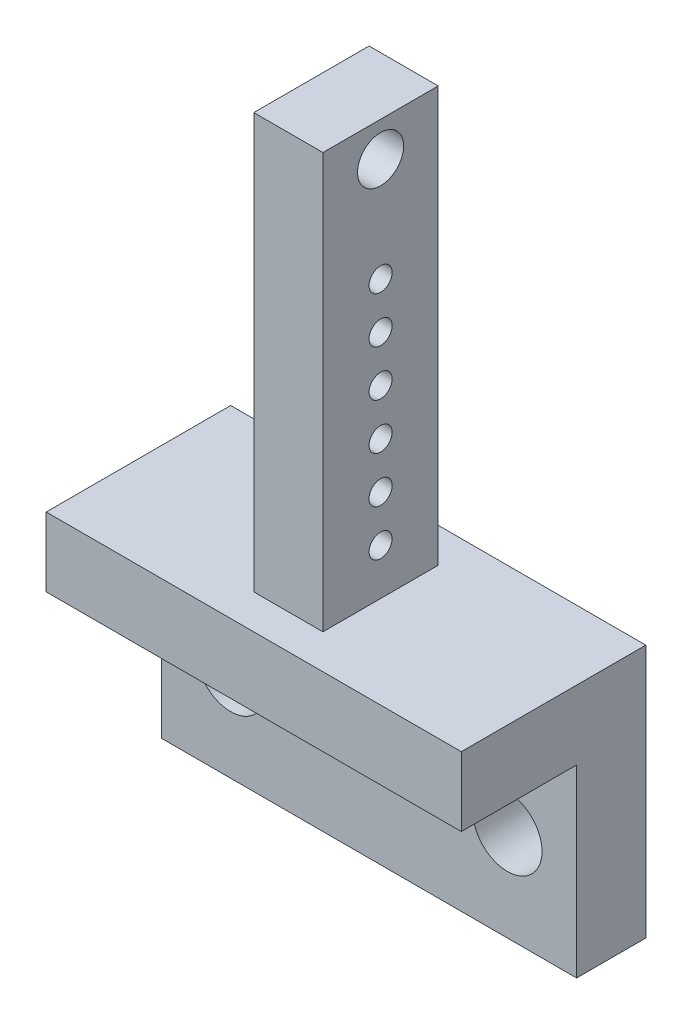
ISO-10303-21;
HEADER;
FILE_DESCRIPTION(('STEP AP214'),'2;1');
FILE_NAME('part.step','',(''),(''),'','','');
FILE_SCHEMA(('AUTOMOTIVE_DESIGN { 1 0 10303 214 1 1 1 1 }'));
ENDSEC;
DATA;
#1=APPLICATION_CONTEXT('core data for automotive mechanical design processes');
#2=APPLICATION_PROTOCOL_DEFINITION('international standard','automotive_design',2000,#1);
#3=PRODUCT_CONTEXT('',#1,'mechanical');
#4=PRODUCT('Part','Part','',(#3));
#5=PRODUCT_RELATED_PRODUCT_CATEGORY('part','',(#4));
#6=PRODUCT_DEFINITION_FORMATION('','',#4);
#7=PRODUCT_DEFINITION_CONTEXT('part definition',#1,'design');
#8=PRODUCT_DEFINITION('design','',#6,#7);
#9=PRODUCT_DEFINITION_SHAPE('','',#8);
#10=(LENGTH_UNIT() NAMED_UNIT(*) SI_UNIT(.MILLI.,.METRE.));
#11=(NAMED_UNIT(*) PLANE_ANGLE_UNIT() SI_UNIT($,.RADIAN.));
#12=(NAMED_UNIT(*) SI_UNIT($,.STERADIAN.) SOLID_ANGLE_UNIT());
#13=UNCERTAINTY_MEASURE_WITH_UNIT(LENGTH_MEASURE(1.E-05),#10,'distance_accuracy_value','');
#14=(GEOMETRIC_REPRESENTATION_CONTEXT(3) GLOBAL_UNCERTAINTY_ASSIGNED_CONTEXT((#13)) GLOBAL_UNIT_ASSIGNED_CONTEXT((#10,
#11,#12)) REPRESENTATION_CONTEXT('',''));
#15=CARTESIAN_POINT('',(0.,0.,0.));
#16=DIRECTION('',(0.,0.,1.));
#17=DIRECTION('',(1.,0.,0.));
#18=AXIS2_PLACEMENT_3D('',#15,#16,#17);
#19=CARTESIAN_POINT('',(-17.2327188940092,4.67626728110599,3.));
#20=DIRECTION('',(0.,-1.,0.));
#21=DIRECTION('',(0.,0.,-1.));
#22=AXIS2_PLACEMENT_3D('',#19,#20,#21);
#23=PLANE('',#22);
#24=DIRECTION('',(-1.,0.,0.));
#25=VECTOR('',#24,1.);
#26=CARTESIAN_POINT('',(-17.2327188940092,4.67626728110599,0.));
#27=LINE('',#26,#25);
#28=CARTESIAN_POINT('',(0.767281105990783,4.67626728110599,0.));
#29=VERTEX_POINT('',#28);
#30=CARTESIAN_POINT('',(-17.2327188940092,4.67626728110599,0.));
#31=VERTEX_POINT('',#30);
#32=EDGE_CURVE('E179',#29,#31,#27,.T.);
#33=ORIENTED_EDGE('',*,*,#32,.T.);
#34=DIRECTION('',(0.,0.,-1.));
#35=VECTOR('',#34,1.);
#36=CARTESIAN_POINT('',(-17.2327188940092,4.67626728110599,3.));
#37=LINE('',#36,#35);
#38=CARTESIAN_POINT('',(-17.2327188940092,4.67626728110599,8.));
#39=VERTEX_POINT('',#38);
#40=EDGE_CURVE('E42',#39,#31,#37,.T.);
#41=ORIENTED_EDGE('',*,*,#40,.F.);
#42=DIRECTION('',(-1.,0.,0.));
#43=VECTOR('',#42,1.);
#44=CARTESIAN_POINT('',(0.767281105990783,4.67626728110599,8.));
#45=LINE('',#44,#43);
#46=CARTESIAN_POINT('',(0.767281105990783,4.67626728110599,8.));
#47=VERTEX_POINT('',#46);
#48=EDGE_CURVE('E143',#47,#39,#45,.T.);
#49=ORIENTED_EDGE('',*,*,#48,.F.);
#50=DIRECTION('',(0.,0.,-1.));
#51=VECTOR('',#50,1.);
#52=CARTESIAN_POINT('',(0.767281105990783,4.67626728110599,3.));
#53=LINE('',#52,#51);
#54=EDGE_CURVE('E11',#47,#29,#53,.T.);
#55=ORIENTED_EDGE('',*,*,#54,.T.);
#56=EDGE_LOOP('',(#33,#41,#49,#55));
#57=FACE_BOUND('',#56,.T.);
#58=DIRECTION('',(0.,0.,-1.));
#59=VECTOR('',#58,1.);
#60=CARTESIAN_POINT('',(-6.73271889400921,4.67626728110599,1.5));
#61=LINE('',#60,#59);
#62=CARTESIAN_POINT('',(-6.73271889400921,4.67626728110599,6.5));
#63=VERTEX_POINT('',#62);
#64=CARTESIAN_POINT('',(-6.73271889400921,4.67626728110599,1.5));
#65=VERTEX_POINT('',#64);
#66=EDGE_CURVE('E50',#63,#65,#61,.T.);
#67=ORIENTED_EDGE('',*,*,#66,.F.);
#68=DIRECTION('',(1.,0.,0.));
#69=VECTOR('',#68,1.);
#70=CARTESIAN_POINT('',(-9.73271889400921,4.67626728110599,6.5));
#71=LINE('',#70,#69);
#72=CARTESIAN_POINT('',(-9.73271889400921,4.67626728110599,6.5));
#73=VERTEX_POINT('',#72);
#74=EDGE_CURVE('E54',#73,#63,#71,.T.);
#75=ORIENTED_EDGE('',*,*,#74,.F.);
#76=DIRECTION('',(0.,0.,1.));
#77=VECTOR('',#76,1.);
#78=CARTESIAN_POINT('',(-9.73271889400921,4.67626728110599,1.5));
#79=LINE('',#78,#77);
#80=CARTESIAN_POINT('',(-9.73271889400921,4.67626728110599,1.5));
#81=VERTEX_POINT('',#80);
#82=EDGE_CURVE('E215',#81,#73,#79,.T.);
#83=ORIENTED_EDGE('',*,*,#82,.F.);
#84=DIRECTION('',(-1.,0.,0.));
#85=VECTOR('',#84,1.);
#86=CARTESIAN_POINT('',(-9.73271889400921,4.67626728110599,1.5));
#87=LINE('',#86,#85);
#88=EDGE_CURVE('E213',#65,#81,#87,.T.);
#89=ORIENTED_EDGE('',*,*,#88,.F.);
#90=EDGE_LOOP('',(#67,#75,#83,#89));
#91=FACE_BOUND('',#90,.T.);
#92=ADVANCED_FACE('F33',(#57,#91),#23,.F.);
#93=CARTESIAN_POINT('',(0.,0.,3.));
#94=DIRECTION('',(0.,0.,1.));
#95=DIRECTION('',(1.,0.,0.));
#96=AXIS2_PLACEMENT_3D('',#93,#94,#95);
#97=PLANE('',#96);
#98=DIRECTION('',(1.,0.,0.));
#99=VECTOR('',#98,1.);
#100=CARTESIAN_POINT('',(0.767281105990783,1.67626728110599,3.));
#101=LINE('',#100,#99);
#102=CARTESIAN_POINT('',(-17.2327188940092,1.67626728110599,3.));
#103=VERTEX_POINT('',#102);
#104=CARTESIAN_POINT('',(0.767281105990783,1.67626728110599,3.));
#105=VERTEX_POINT('',#104);
#106=EDGE_CURVE('E132',#103,#105,#101,.T.);
#107=ORIENTED_EDGE('',*,*,#106,.F.);
#108=DIRECTION('',(0.,-1.,0.));
#109=VECTOR('',#108,1.);
#110=CARTESIAN_POINT('',(-17.2327188940092,4.67626728110599,3.));
#111=LINE('',#110,#109);
#112=CARTESIAN_POINT('',(-17.2327188940092,-6.32373271889401,3.));
#113=VERTEX_POINT('',#112);
#114=EDGE_CURVE('E171',#103,#113,#111,.T.);
#115=ORIENTED_EDGE('',*,*,#114,.T.);
#116=DIRECTION('',(1.,0.,0.));
#117=VECTOR('',#116,1.);
#118=CARTESIAN_POINT('',(-17.2327188940092,-6.32373271889401,3.));
#119=LINE('',#118,#117);
#120=CARTESIAN_POINT('',(0.767281105990786,-6.32373271889401,3.));
#121=VERTEX_POINT('',#120);
#122=EDGE_CURVE('E174',#113,#121,#119,.T.);
#123=ORIENTED_EDGE('',*,*,#122,.T.);
#124=DIRECTION('',(0.,1.,0.));
#125=VECTOR('',#124,1.);
#126=CARTESIAN_POINT('',(0.767281105990783,4.67626728110599,3.));
#127=LINE('',#126,#125);
#128=EDGE_CURVE('E169',#121,#105,#127,.T.);
#129=ORIENTED_EDGE('',*,*,#128,.T.);
#130=EDGE_LOOP('',(#107,#115,#123,#129));
#131=FACE_BOUND('',#130,.T.);
#132=CARTESIAN_POINT('',(-14.2327188940092,-2.32373271889401,3.));
#133=DIRECTION('',(0.,0.,1.));
#134=DIRECTION('',(1.,0.,0.));
#135=AXIS2_PLACEMENT_3D('',#132,#133,#134);
#136=CIRCLE('',#135,1.5);
#137=CARTESIAN_POINT('',(-12.7327188940092,-2.32373271889401,3.));
#138=VERTEX_POINT('',#137);
#139=EDGE_CURVE('E163',#138,#138,#136,.T.);
#140=ORIENTED_EDGE('',*,*,#139,.F.);
#141=EDGE_LOOP('',(#140));
#142=FACE_BOUND('',#141,.T.);
#143=CARTESIAN_POINT('',(-2.23271889400921,-2.32373271889401,3.));
#144=DIRECTION('',(0.,0.,1.));
#145=DIRECTION('',(1.,0.,0.));
#146=AXIS2_PLACEMENT_3D('',#143,#144,#145);
#147=CIRCLE('',#146,1.5);
#148=CARTESIAN_POINT('',(-0.732718894009214,-2.32373271889401,3.));
#149=VERTEX_POINT('',#148);
#150=EDGE_CURVE('E157',#149,#149,#147,.T.);
#151=ORIENTED_EDGE('',*,*,#150,.F.);
#152=EDGE_LOOP('',(#151));
#153=FACE_BOUND('',#152,.T.);
#154=ADVANCED_FACE('F230',(#131,#142,#153),#97,.T.);
#155=CARTESIAN_POINT('',(0.,0.,0.));
#156=DIRECTION('',(0.,0.,1.));
#157=DIRECTION('',(1.,0.,0.));
#158=AXIS2_PLACEMENT_3D('',#155,#156,#157);
#159=PLANE('',#158);
#160=DIRECTION('',(0.,1.,0.));
#161=VECTOR('',#160,1.);
#162=CARTESIAN_POINT('',(0.767281105990783,4.67626728110599,0.));
#163=LINE('',#162,#161);
#164=CARTESIAN_POINT('',(0.767281105990786,-6.32373271889401,0.));
#165=VERTEX_POINT('',#164);
#166=EDGE_CURVE('E166',#165,#29,#163,.T.);
#167=ORIENTED_EDGE('',*,*,#166,.F.);
#168=DIRECTION('',(1.,0.,0.));
#169=VECTOR('',#168,1.);
#170=CARTESIAN_POINT('',(-17.2327188940092,-6.32373271889401,0.));
#171=LINE('',#170,#169);
#172=CARTESIAN_POINT('',(-17.2327188940092,-6.32373271889401,0.));
#173=VERTEX_POINT('',#172);
#174=EDGE_CURVE('E172',#173,#165,#171,.T.);
#175=ORIENTED_EDGE('',*,*,#174,.F.);
#176=DIRECTION('',(0.,-1.,0.));
#177=VECTOR('',#176,1.);
#178=CARTESIAN_POINT('',(-17.2327188940092,4.67626728110599,0.));
#179=LINE('',#178,#177);
#180=EDGE_CURVE('E181',#31,#173,#179,.T.);
#181=ORIENTED_EDGE('',*,*,#180,.F.);
#182=ORIENTED_EDGE('',*,*,#32,.F.);
#183=EDGE_LOOP('',(#167,#175,#181,#182));
#184=FACE_BOUND('',#183,.T.);
#185=CARTESIAN_POINT('',(-14.2327188940092,-2.32373271889401,0.));
#186=DIRECTION('',(0.,0.,1.));
#187=DIRECTION('',(1.,0.,0.));
#188=AXIS2_PLACEMENT_3D('',#185,#186,#187);
#189=CIRCLE('',#188,1.5);
#190=CARTESIAN_POINT('',(-12.7327188940092,-2.32373271889401,0.));
#191=VERTEX_POINT('',#190);
#192=EDGE_CURVE('E160',#191,#191,#189,.T.);
#193=ORIENTED_EDGE('',*,*,#192,.T.);
#194=EDGE_LOOP('',(#193));
#195=FACE_BOUND('',#194,.T.);
#196=CARTESIAN_POINT('',(-2.23271889400921,-2.32373271889401,0.));
#197=DIRECTION('',(0.,0.,1.));
#198=DIRECTION('',(1.,0.,0.));
#199=AXIS2_PLACEMENT_3D('',#196,#197,#198);
#200=CIRCLE('',#199,1.5);
#201=CARTESIAN_POINT('',(-0.732718894009214,-2.32373271889401,0.));
#202=VERTEX_POINT('',#201);
#203=EDGE_CURVE('E156',#202,#202,#200,.T.);
#204=ORIENTED_EDGE('',*,*,#203,.T.);
#205=EDGE_LOOP('',(#204));
#206=FACE_BOUND('',#205,.T.);
#207=ADVANCED_FACE('F235',(#184,#195,#206),#159,.F.);
#208=CARTESIAN_POINT('',(0.767281105990783,4.67626728110599,3.));
#209=DIRECTION('',(-1.,0.,0.));
#210=DIRECTION('',(0.,-1.,0.));
#211=AXIS2_PLACEMENT_3D('',#208,#209,#210);
#212=PLANE('',#211);
#213=ORIENTED_EDGE('',*,*,#166,.T.);
#214=ORIENTED_EDGE('',*,*,#54,.F.);
#215=DIRECTION('',(0.,1.,0.));
#216=VECTOR('',#215,1.);
#217=CARTESIAN_POINT('',(0.767281105990783,4.67626728110599,8.));
#218=LINE('',#217,#216);
#219=CARTESIAN_POINT('',(0.767281105990783,1.67626728110599,8.));
#220=VERTEX_POINT('',#219);
#221=EDGE_CURVE('E135',#220,#47,#218,.T.);
#222=ORIENTED_EDGE('',*,*,#221,.F.);
#223=DIRECTION('',(0.,0.,-1.));
#224=VECTOR('',#223,1.);
#225=CARTESIAN_POINT('',(0.767281105990783,1.67626728110599,8.));
#226=LINE('',#225,#224);
#227=EDGE_CURVE('E149',#220,#105,#226,.T.);
#228=ORIENTED_EDGE('',*,*,#227,.T.);
#229=ORIENTED_EDGE('',*,*,#128,.F.);
#230=DIRECTION('',(0.,0.,-1.));
#231=VECTOR('',#230,1.);
#232=CARTESIAN_POINT('',(0.767281105990786,-6.32373271889401,3.));
#233=LINE('',#232,#231);
#234=EDGE_CURVE('E176',#121,#165,#233,.T.);
#235=ORIENTED_EDGE('',*,*,#234,.T.);
#236=EDGE_LOOP('',(#213,#214,#222,#228,#229,#235));
#237=FACE_BOUND('',#236,.T.);
#238=ADVANCED_FACE('F35',(#237),#212,.F.);
#239=CARTESIAN_POINT('',(-17.2327188940092,4.67626728110599,3.));
#240=DIRECTION('',(1.,0.,0.));
#241=DIRECTION('',(0.,1.,0.));
#242=AXIS2_PLACEMENT_3D('',#239,#240,#241);
#243=PLANE('',#242);
#244=ORIENTED_EDGE('',*,*,#180,.T.);
#245=DIRECTION('',(0.,0.,-1.));
#246=VECTOR('',#245,1.);
#247=CARTESIAN_POINT('',(-17.2327188940092,-6.32373271889401,3.));
#248=LINE('',#247,#246);
#249=EDGE_CURVE('E186',#113,#173,#248,.T.);
#250=ORIENTED_EDGE('',*,*,#249,.F.);
#251=ORIENTED_EDGE('',*,*,#114,.F.);
#252=DIRECTION('',(0.,0.,-1.));
#253=VECTOR('',#252,1.);
#254=CARTESIAN_POINT('',(-17.2327188940092,1.67626728110599,8.));
#255=LINE('',#254,#253);
#256=CARTESIAN_POINT('',(-17.2327188940092,1.67626728110599,8.));
#257=VERTEX_POINT('',#256);
#258=EDGE_CURVE('E153',#257,#103,#255,.T.);
#259=ORIENTED_EDGE('',*,*,#258,.F.);
#260=DIRECTION('',(0.,-1.,0.));
#261=VECTOR('',#260,1.);
#262=CARTESIAN_POINT('',(-17.2327188940092,4.67626728110599,8.));
#263=LINE('',#262,#261);
#264=EDGE_CURVE('E146',#39,#257,#263,.T.);
#265=ORIENTED_EDGE('',*,*,#264,.F.);
#266=ORIENTED_EDGE('',*,*,#40,.T.);
#267=EDGE_LOOP('',(#244,#250,#251,#259,#265,#266));
#268=FACE_BOUND('',#267,.T.);
#269=ADVANCED_FACE('F239',(#268),#243,.F.);
#270=CARTESIAN_POINT('',(-17.2327188940092,-6.32373271889401,3.));
#271=DIRECTION('',(0.,1.,0.));
#272=DIRECTION('',(-1.,0.,0.));
#273=AXIS2_PLACEMENT_3D('',#270,#271,#272);
#274=PLANE('',#273);
#275=ORIENTED_EDGE('',*,*,#174,.T.);
#276=ORIENTED_EDGE('',*,*,#234,.F.);
#277=ORIENTED_EDGE('',*,*,#122,.F.);
#278=ORIENTED_EDGE('',*,*,#249,.T.);
#279=EDGE_LOOP('',(#275,#276,#277,#278));
#280=FACE_BOUND('',#279,.T.);
#281=ADVANCED_FACE('F242',(#280),#274,.F.);
#282=CARTESIAN_POINT('',(-14.2327188940092,-2.32373271889401,3.));
#283=DIRECTION('',(0.,0.,-1.));
#284=DIRECTION('',(-1.,0.,0.));
#285=AXIS2_PLACEMENT_3D('',#282,#283,#284);
#286=CYLINDRICAL_SURFACE('',#285,1.5);
#287=ORIENTED_EDGE('',*,*,#139,.T.);
#288=EDGE_LOOP('',(#287));
#289=FACE_BOUND('',#288,.T.);
#290=ORIENTED_EDGE('',*,*,#192,.F.);
#291=EDGE_LOOP('',(#290));
#292=FACE_BOUND('',#291,.T.);
#293=ADVANCED_FACE('F246',(#289,#292),#286,.F.);
#294=CARTESIAN_POINT('',(-2.23271889400921,-2.32373271889401,3.));
#295=DIRECTION('',(0.,0.,-1.));
#296=DIRECTION('',(-1.,0.,0.));
#297=AXIS2_PLACEMENT_3D('',#294,#295,#296);
#298=CYLINDRICAL_SURFACE('',#297,1.5);
#299=ORIENTED_EDGE('',*,*,#150,.T.);
#300=EDGE_LOOP('',(#299));
#301=FACE_BOUND('',#300,.T.);
#302=ORIENTED_EDGE('',*,*,#203,.F.);
#303=EDGE_LOOP('',(#302));
#304=FACE_BOUND('',#303,.T.);
#305=ADVANCED_FACE('F253',(#301,#304),#298,.F.);
#306=CARTESIAN_POINT('',(0.767281105990783,1.67626728110599,8.));
#307=DIRECTION('',(0.,1.,0.));
#308=DIRECTION('',(-1.,0.,0.));
#309=AXIS2_PLACEMENT_3D('',#306,#307,#308);
#310=PLANE('',#309);
#311=ORIENTED_EDGE('',*,*,#106,.T.);
#312=ORIENTED_EDGE('',*,*,#227,.F.);
#313=DIRECTION('',(1.,0.,0.));
#314=VECTOR('',#313,1.);
#315=CARTESIAN_POINT('',(0.767281105990783,1.67626728110599,8.));
#316=LINE('',#315,#314);
#317=EDGE_CURVE('E148',#257,#220,#316,.T.);
#318=ORIENTED_EDGE('',*,*,#317,.F.);
#319=ORIENTED_EDGE('',*,*,#258,.T.);
#320=EDGE_LOOP('',(#311,#312,#318,#319));
#321=FACE_BOUND('',#320,.T.);
#322=ADVANCED_FACE('F257',(#321),#310,.F.);
#323=CARTESIAN_POINT('',(0.,0.,8.));
#324=DIRECTION('',(0.,0.,-1.));
#325=DIRECTION('',(-1.,0.,0.));
#326=AXIS2_PLACEMENT_3D('',#323,#324,#325);
#327=PLANE('',#326);
#328=ORIENTED_EDGE('',*,*,#221,.T.);
#329=ORIENTED_EDGE('',*,*,#48,.T.);
#330=ORIENTED_EDGE('',*,*,#264,.T.);
#331=ORIENTED_EDGE('',*,*,#317,.T.);
#332=EDGE_LOOP('',(#328,#329,#330,#331));
#333=FACE_BOUND('',#332,.T.);
#334=ADVANCED_FACE('F261',(#333),#327,.F.);
#335=CARTESIAN_POINT('',(-6.73271889400921,22.676267281106,1.5));
#336=DIRECTION('',(-1.,0.,0.));
#337=DIRECTION('',(0.,0.,1.));
#338=AXIS2_PLACEMENT_3D('',#335,#336,#337);
#339=PLANE('',#338);
#340=CARTESIAN_POINT('',(-6.73271889400921,6.67626728110599,4.));
#341=DIRECTION('',(1.,0.,0.));
#342=DIRECTION('',(0.,0.,-1.));
#343=AXIS2_PLACEMENT_3D('',#340,#341,#342);
#344=CIRCLE('',#343,0.5);
#345=CARTESIAN_POINT('',(-6.73271889400921,6.67626728110599,3.5));
#346=VERTEX_POINT('',#345);
#347=EDGE_CURVE('E195',#346,#346,#344,.T.);
#348=ORIENTED_EDGE('',*,*,#347,.F.);
#349=EDGE_LOOP('',(#348));
#350=FACE_BOUND('',#349,.T.);
#351=CARTESIAN_POINT('',(-6.73271889400921,8.67626728110599,4.));
#352=DIRECTION('',(1.,0.,0.));
#353=DIRECTION('',(0.,0.,-1.));
#354=AXIS2_PLACEMENT_3D('',#351,#352,#353);
#355=CIRCLE('',#354,0.5);
#356=CARTESIAN_POINT('',(-6.73271889400921,8.67626728110599,3.5));
#357=VERTEX_POINT('',#356);
#358=EDGE_CURVE('E309',#357,#357,#355,.T.);
#359=ORIENTED_EDGE('',*,*,#358,.F.);
#360=EDGE_LOOP('',(#359));
#361=FACE_BOUND('',#360,.T.);
#362=CARTESIAN_POINT('',(-6.73271889400921,10.676267281106,4.));
#363=DIRECTION('',(1.,0.,0.));
#364=DIRECTION('',(0.,0.,-1.));
#365=AXIS2_PLACEMENT_3D('',#362,#363,#364);
#366=CIRCLE('',#365,0.5);
#367=CARTESIAN_POINT('',(-6.73271889400921,10.676267281106,3.5));
#368=VERTEX_POINT('',#367);
#369=EDGE_CURVE('E312',#368,#368,#366,.T.);
#370=ORIENTED_EDGE('',*,*,#369,.F.);
#371=EDGE_LOOP('',(#370));
#372=FACE_BOUND('',#371,.T.);
#373=CARTESIAN_POINT('',(-6.73271889400921,12.676267281106,4.));
#374=DIRECTION('',(1.,0.,0.));
#375=DIRECTION('',(0.,0.,-1.));
#376=AXIS2_PLACEMENT_3D('',#373,#374,#375);
#377=CIRCLE('',#376,0.5);
#378=CARTESIAN_POINT('',(-6.73271889400921,12.676267281106,3.5));
#379=VERTEX_POINT('',#378);
#380=EDGE_CURVE('E317',#379,#379,#377,.T.);
#381=ORIENTED_EDGE('',*,*,#380,.F.);
#382=EDGE_LOOP('',(#381));
#383=FACE_BOUND('',#382,.T.);
#384=CARTESIAN_POINT('',(-6.73271889400921,14.676267281106,4.));
#385=DIRECTION('',(1.,0.,0.));
#386=DIRECTION('',(0.,0.,-1.));
#387=AXIS2_PLACEMENT_3D('',#384,#385,#386);
#388=CIRCLE('',#387,0.5);
#389=CARTESIAN_POINT('',(-6.73271889400921,14.676267281106,3.5));
#390=VERTEX_POINT('',#389);
#391=EDGE_CURVE('E320',#390,#390,#388,.T.);
#392=ORIENTED_EDGE('',*,*,#391,.F.);
#393=EDGE_LOOP('',(#392));
#394=FACE_BOUND('',#393,.T.);
#395=CARTESIAN_POINT('',(-6.73271889400921,16.676267281106,4.));
#396=DIRECTION('',(1.,0.,0.));
#397=DIRECTION('',(0.,0.,-1.));
#398=AXIS2_PLACEMENT_3D('',#395,#396,#397);
#399=CIRCLE('',#398,0.5);
#400=CARTESIAN_POINT('',(-6.73271889400921,16.676267281106,3.5));
#401=VERTEX_POINT('',#400);
#402=EDGE_CURVE('E323',#401,#401,#399,.T.);
#403=ORIENTED_EDGE('',*,*,#402,.F.);
#404=EDGE_LOOP('',(#403));
#405=FACE_BOUND('',#404,.T.);
#406=CARTESIAN_POINT('',(-6.73271889400921,21.176267281106,4.));
#407=DIRECTION('',(1.,0.,0.));
#408=DIRECTION('',(0.,0.,-1.));
#409=AXIS2_PLACEMENT_3D('',#406,#407,#408);
#410=CIRCLE('',#409,1.);
#411=CARTESIAN_POINT('',(-6.73271889400921,21.176267281106,3.));
#412=VERTEX_POINT('',#411);
#413=EDGE_CURVE('E326',#412,#412,#410,.T.);
#414=ORIENTED_EDGE('',*,*,#413,.F.);
#415=EDGE_LOOP('',(#414));
#416=FACE_BOUND('',#415,.T.);
#417=ORIENTED_EDGE('',*,*,#66,.T.);
#418=DIRECTION('',(0.,-1.,0.));
#419=VECTOR('',#418,1.);
#420=CARTESIAN_POINT('',(-6.73271889400921,22.676267281106,1.5));
#421=LINE('',#420,#419);
#422=CARTESIAN_POINT('',(-6.73271889400921,22.676267281106,1.5));
#423=VERTEX_POINT('',#422);
#424=EDGE_CURVE('E115',#423,#65,#421,.T.);
#425=ORIENTED_EDGE('',*,*,#424,.F.);
#426=DIRECTION('',(0.,0.,-1.));
#427=VECTOR('',#426,1.);
#428=CARTESIAN_POINT('',(-6.73271889400921,22.676267281106,1.5));
#429=LINE('',#428,#427);
#430=CARTESIAN_POINT('',(-6.73271889400921,22.676267281106,6.5));
#431=VERTEX_POINT('',#430);
#432=EDGE_CURVE('E121',#431,#423,#429,.T.);
#433=ORIENTED_EDGE('',*,*,#432,.F.);
#434=DIRECTION('',(0.,-1.,0.));
#435=VECTOR('',#434,1.);
#436=CARTESIAN_POINT('',(-6.73271889400921,22.676267281106,6.5));
#437=LINE('',#436,#435);
#438=EDGE_CURVE('E222',#431,#63,#437,.T.);
#439=ORIENTED_EDGE('',*,*,#438,.T.);
#440=EDGE_LOOP('',(#417,#425,#433,#439));
#441=FACE_BOUND('',#440,.T.);
#442=ADVANCED_FACE('F131',(#350,#361,#372,#383,#394,#405,#416,#441),#339,.F.);
#443=CARTESIAN_POINT('',(-9.73271889400921,22.676267281106,1.5));
#444=DIRECTION('',(0.,0.,1.));
#445=DIRECTION('',(1.,0.,0.));
#446=AXIS2_PLACEMENT_3D('',#443,#444,#445);
#447=PLANE('',#446);
#448=ORIENTED_EDGE('',*,*,#88,.T.);
#449=DIRECTION('',(0.,-1.,0.));
#450=VECTOR('',#449,1.);
#451=CARTESIAN_POINT('',(-9.73271889400921,22.676267281106,1.5));
#452=LINE('',#451,#450);
#453=CARTESIAN_POINT('',(-9.73271889400921,22.676267281106,1.5));
#454=VERTEX_POINT('',#453);
#455=EDGE_CURVE('E117',#454,#81,#452,.T.);
#456=ORIENTED_EDGE('',*,*,#455,.F.);
#457=DIRECTION('',(-1.,0.,0.));
#458=VECTOR('',#457,1.);
#459=CARTESIAN_POINT('',(-9.73271889400921,22.676267281106,1.5));
#460=LINE('',#459,#458);
#461=EDGE_CURVE('E110',#423,#454,#460,.T.);
#462=ORIENTED_EDGE('',*,*,#461,.F.);
#463=ORIENTED_EDGE('',*,*,#424,.T.);
#464=EDGE_LOOP('',(#448,#456,#462,#463));
#465=FACE_BOUND('',#464,.T.);
#466=ADVANCED_FACE('F113',(#465),#447,.F.);
#467=CARTESIAN_POINT('',(-9.73271889400921,22.676267281106,1.5));
#468=DIRECTION('',(1.,0.,0.));
#469=DIRECTION('',(0.,0.,-1.));
#470=AXIS2_PLACEMENT_3D('',#467,#468,#469);
#471=PLANE('',#470);
#472=CARTESIAN_POINT('',(-9.73271889400921,6.67626728110599,4.));
#473=DIRECTION('',(1.,0.,0.));
#474=DIRECTION('',(0.,0.,-1.));
#475=AXIS2_PLACEMENT_3D('',#472,#473,#474);
#476=CIRCLE('',#475,0.5);
#477=CARTESIAN_POINT('',(-9.73271889400921,6.67626728110599,3.5));
#478=VERTEX_POINT('',#477);
#479=EDGE_CURVE('E37',#478,#478,#476,.T.);
#480=ORIENTED_EDGE('',*,*,#479,.T.);
#481=EDGE_LOOP('',(#480));
#482=FACE_BOUND('',#481,.T.);
#483=CARTESIAN_POINT('',(-9.73271889400921,8.67626728110599,4.));
#484=DIRECTION('',(1.,0.,0.));
#485=DIRECTION('',(0.,0.,-1.));
#486=AXIS2_PLACEMENT_3D('',#483,#484,#485);
#487=CIRCLE('',#486,0.5);
#488=CARTESIAN_POINT('',(-9.73271889400921,8.67626728110599,3.5));
#489=VERTEX_POINT('',#488);
#490=EDGE_CURVE('E206',#489,#489,#487,.T.);
#491=ORIENTED_EDGE('',*,*,#490,.T.);
#492=EDGE_LOOP('',(#491));
#493=FACE_BOUND('',#492,.T.);
#494=CARTESIAN_POINT('',(-9.73271889400921,10.676267281106,4.));
#495=DIRECTION('',(1.,0.,0.));
#496=DIRECTION('',(0.,0.,-1.));
#497=AXIS2_PLACEMENT_3D('',#494,#495,#496);
#498=CIRCLE('',#497,0.5);
#499=CARTESIAN_POINT('',(-9.73271889400921,10.676267281106,3.5));
#500=VERTEX_POINT('',#499);
#501=EDGE_CURVE('E204',#500,#500,#498,.T.);
#502=ORIENTED_EDGE('',*,*,#501,.T.);
#503=EDGE_LOOP('',(#502));
#504=FACE_BOUND('',#503,.T.);
#505=CARTESIAN_POINT('',(-9.73271889400921,12.676267281106,4.));
#506=DIRECTION('',(1.,0.,0.));
#507=DIRECTION('',(0.,0.,-1.));
#508=AXIS2_PLACEMENT_3D('',#505,#506,#507);
#509=CIRCLE('',#508,0.5);
#510=CARTESIAN_POINT('',(-9.73271889400921,12.676267281106,3.5));
#511=VERTEX_POINT('',#510);
#512=EDGE_CURVE('E201',#511,#511,#509,.T.);
#513=ORIENTED_EDGE('',*,*,#512,.T.);
#514=EDGE_LOOP('',(#513));
#515=FACE_BOUND('',#514,.T.);
#516=CARTESIAN_POINT('',(-9.73271889400921,14.676267281106,4.));
#517=DIRECTION('',(1.,0.,0.));
#518=DIRECTION('',(0.,0.,-1.));
#519=AXIS2_PLACEMENT_3D('',#516,#517,#518);
#520=CIRCLE('',#519,0.5);
#521=CARTESIAN_POINT('',(-9.73271889400921,14.676267281106,3.5));
#522=VERTEX_POINT('',#521);
#523=EDGE_CURVE('E198',#522,#522,#520,.T.);
#524=ORIENTED_EDGE('',*,*,#523,.T.);
#525=EDGE_LOOP('',(#524));
#526=FACE_BOUND('',#525,.T.);
#527=CARTESIAN_POINT('',(-9.73271889400921,16.676267281106,4.));
#528=DIRECTION('',(1.,0.,0.));
#529=DIRECTION('',(0.,0.,-1.));
#530=AXIS2_PLACEMENT_3D('',#527,#528,#529);
#531=CIRCLE('',#530,0.5);
#532=CARTESIAN_POINT('',(-9.73271889400921,16.676267281106,3.5));
#533=VERTEX_POINT('',#532);
#534=EDGE_CURVE('E194',#533,#533,#531,.T.);
#535=ORIENTED_EDGE('',*,*,#534,.T.);
#536=EDGE_LOOP('',(#535));
#537=FACE_BOUND('',#536,.T.);
#538=CARTESIAN_POINT('',(-9.73271889400921,21.176267281106,4.));
#539=DIRECTION('',(1.,0.,0.));
#540=DIRECTION('',(0.,0.,-1.));
#541=AXIS2_PLACEMENT_3D('',#538,#539,#540);
#542=CIRCLE('',#541,1.);
#543=CARTESIAN_POINT('',(-9.73271889400921,21.176267281106,3.));
#544=VERTEX_POINT('',#543);
#545=EDGE_CURVE('E191',#544,#544,#542,.T.);
#546=ORIENTED_EDGE('',*,*,#545,.T.);
#547=EDGE_LOOP('',(#546));
#548=FACE_BOUND('',#547,.T.);
#549=ORIENTED_EDGE('',*,*,#82,.T.);
#550=DIRECTION('',(0.,-1.,0.));
#551=VECTOR('',#550,1.);
#552=CARTESIAN_POINT('',(-9.73271889400921,22.676267281106,6.5));
#553=LINE('',#552,#551);
#554=CARTESIAN_POINT('',(-9.73271889400921,22.676267281106,6.5));
#555=VERTEX_POINT('',#554);
#556=EDGE_CURVE('E137',#555,#73,#553,.T.);
#557=ORIENTED_EDGE('',*,*,#556,.F.);
#558=DIRECTION('',(0.,0.,1.));
#559=VECTOR('',#558,1.);
#560=CARTESIAN_POINT('',(-9.73271889400921,22.676267281106,1.5));
#561=LINE('',#560,#559);
#562=EDGE_CURVE('E120',#454,#555,#561,.T.);
#563=ORIENTED_EDGE('',*,*,#562,.F.);
#564=ORIENTED_EDGE('',*,*,#455,.T.);
#565=EDGE_LOOP('',(#549,#557,#563,#564));
#566=FACE_BOUND('',#565,.T.);
#567=ADVANCED_FACE('F228',(#482,#493,#504,#515,#526,#537,#548,#566),#471,.F.);
#568=CARTESIAN_POINT('',(-9.73271889400921,22.676267281106,6.5));
#569=DIRECTION('',(0.,0.,-1.));
#570=DIRECTION('',(-1.,0.,0.));
#571=AXIS2_PLACEMENT_3D('',#568,#569,#570);
#572=PLANE('',#571);
#573=ORIENTED_EDGE('',*,*,#74,.T.);
#574=ORIENTED_EDGE('',*,*,#438,.F.);
#575=DIRECTION('',(1.,0.,0.));
#576=VECTOR('',#575,1.);
#577=CARTESIAN_POINT('',(-9.73271889400921,22.676267281106,6.5));
#578=LINE('',#577,#576);
#579=EDGE_CURVE('E126',#555,#431,#578,.T.);
#580=ORIENTED_EDGE('',*,*,#579,.F.);
#581=ORIENTED_EDGE('',*,*,#556,.T.);
#582=EDGE_LOOP('',(#573,#574,#580,#581));
#583=FACE_BOUND('',#582,.T.);
#584=ADVANCED_FACE('F226',(#583),#572,.F.);
#585=CARTESIAN_POINT('',(0.,22.676267281106,0.));
#586=DIRECTION('',(0.,1.,0.));
#587=DIRECTION('',(0.,0.,1.));
#588=AXIS2_PLACEMENT_3D('',#585,#586,#587);
#589=PLANE('',#588);
#590=ORIENTED_EDGE('',*,*,#432,.T.);
#591=ORIENTED_EDGE('',*,*,#461,.T.);
#592=ORIENTED_EDGE('',*,*,#562,.T.);
#593=ORIENTED_EDGE('',*,*,#579,.T.);
#594=EDGE_LOOP('',(#590,#591,#592,#593));
#595=FACE_BOUND('',#594,.T.);
#596=ADVANCED_FACE('F124',(#595),#589,.T.);
#597=CARTESIAN_POINT('',(-24.7327188940092,21.176267281106,4.));
#598=DIRECTION('',(1.,0.,0.));
#599=DIRECTION('',(0.,0.,-1.));
#600=AXIS2_PLACEMENT_3D('',#597,#598,#599);
#601=CYLINDRICAL_SURFACE('',#600,1.);
#602=ORIENTED_EDGE('',*,*,#413,.T.);
#603=EDGE_LOOP('',(#602));
#604=FACE_BOUND('',#603,.T.);
#605=ORIENTED_EDGE('',*,*,#545,.F.);
#606=EDGE_LOOP('',(#605));
#607=FACE_BOUND('',#606,.T.);
#608=ADVANCED_FACE('F277',(#604,#607),#601,.F.);
#609=CARTESIAN_POINT('',(-24.7327188940092,16.676267281106,4.));
#610=DIRECTION('',(1.,0.,0.));
#611=DIRECTION('',(0.,0.,-1.));
#612=AXIS2_PLACEMENT_3D('',#609,#610,#611);
#613=CYLINDRICAL_SURFACE('',#612,0.5);
#614=ORIENTED_EDGE('',*,*,#402,.T.);
#615=EDGE_LOOP('',(#614));
#616=FACE_BOUND('',#615,.T.);
#617=ORIENTED_EDGE('',*,*,#534,.F.);
#618=EDGE_LOOP('',(#617));
#619=FACE_BOUND('',#618,.T.);
#620=ADVANCED_FACE('F280',(#616,#619),#613,.F.);
#621=CARTESIAN_POINT('',(-24.7327188940092,14.676267281106,4.));
#622=DIRECTION('',(1.,0.,0.));
#623=DIRECTION('',(0.,0.,-1.));
#624=AXIS2_PLACEMENT_3D('',#621,#622,#623);
#625=CYLINDRICAL_SURFACE('',#624,0.5);
#626=ORIENTED_EDGE('',*,*,#391,.T.);
#627=EDGE_LOOP('',(#626));
#628=FACE_BOUND('',#627,.T.);
#629=ORIENTED_EDGE('',*,*,#523,.F.);
#630=EDGE_LOOP('',(#629));
#631=FACE_BOUND('',#630,.T.);
#632=ADVANCED_FACE('F284',(#628,#631),#625,.F.);
#633=CARTESIAN_POINT('',(-24.7327188940092,12.676267281106,4.));
#634=DIRECTION('',(1.,0.,0.));
#635=DIRECTION('',(0.,0.,-1.));
#636=AXIS2_PLACEMENT_3D('',#633,#634,#635);
#637=CYLINDRICAL_SURFACE('',#636,0.5);
#638=ORIENTED_EDGE('',*,*,#380,.T.);
#639=EDGE_LOOP('',(#638));
#640=FACE_BOUND('',#639,.T.);
#641=ORIENTED_EDGE('',*,*,#512,.F.);
#642=EDGE_LOOP('',(#641));
#643=FACE_BOUND('',#642,.T.);
#644=ADVANCED_FACE('F288',(#640,#643),#637,.F.);
#645=CARTESIAN_POINT('',(-24.7327188940092,10.676267281106,4.));
#646=DIRECTION('',(1.,0.,0.));
#647=DIRECTION('',(0.,0.,-1.));
#648=AXIS2_PLACEMENT_3D('',#645,#646,#647);
#649=CYLINDRICAL_SURFACE('',#648,0.5);
#650=ORIENTED_EDGE('',*,*,#369,.T.);
#651=EDGE_LOOP('',(#650));
#652=FACE_BOUND('',#651,.T.);
#653=ORIENTED_EDGE('',*,*,#501,.F.);
#654=EDGE_LOOP('',(#653));
#655=FACE_BOUND('',#654,.T.);
#656=ADVANCED_FACE('F292',(#652,#655),#649,.F.);
#657=CARTESIAN_POINT('',(-24.7327188940092,8.67626728110599,4.));
#658=DIRECTION('',(1.,0.,0.));
#659=DIRECTION('',(0.,0.,-1.));
#660=AXIS2_PLACEMENT_3D('',#657,#658,#659);
#661=CYLINDRICAL_SURFACE('',#660,0.5);
#662=ORIENTED_EDGE('',*,*,#358,.T.);
#663=EDGE_LOOP('',(#662));
#664=FACE_BOUND('',#663,.T.);
#665=ORIENTED_EDGE('',*,*,#490,.F.);
#666=EDGE_LOOP('',(#665));
#667=FACE_BOUND('',#666,.T.);
#668=ADVANCED_FACE('F296',(#664,#667),#661,.F.);
#669=CARTESIAN_POINT('',(-24.7327188940092,6.67626728110599,4.));
#670=DIRECTION('',(1.,0.,0.));
#671=DIRECTION('',(0.,0.,-1.));
#672=AXIS2_PLACEMENT_3D('',#669,#670,#671);
#673=CYLINDRICAL_SURFACE('',#672,0.5);
#674=ORIENTED_EDGE('',*,*,#347,.T.);
#675=EDGE_LOOP('',(#674));
#676=FACE_BOUND('',#675,.T.);
#677=ORIENTED_EDGE('',*,*,#479,.F.);
#678=EDGE_LOOP('',(#677));
#679=FACE_BOUND('',#678,.T.);
#680=ADVANCED_FACE('F300',(#676,#679),#673,.F.);
#681=CLOSED_SHELL('',(#92,#154,#207,#238,#269,#281,#293,#305,#322,#334,#442,#466,#567,#584,#596,
#608,#620,#632,#644,#656,#668,#680));
#682=MANIFOLD_SOLID_BREP('B2',#681);
#683=ADVANCED_BREP_SHAPE_REPRESENTATION('',(#18,#682),#14);
#684=SHAPE_DEFINITION_REPRESENTATION(#9,#683);
ENDSEC;
END-ISO-10303-21;
